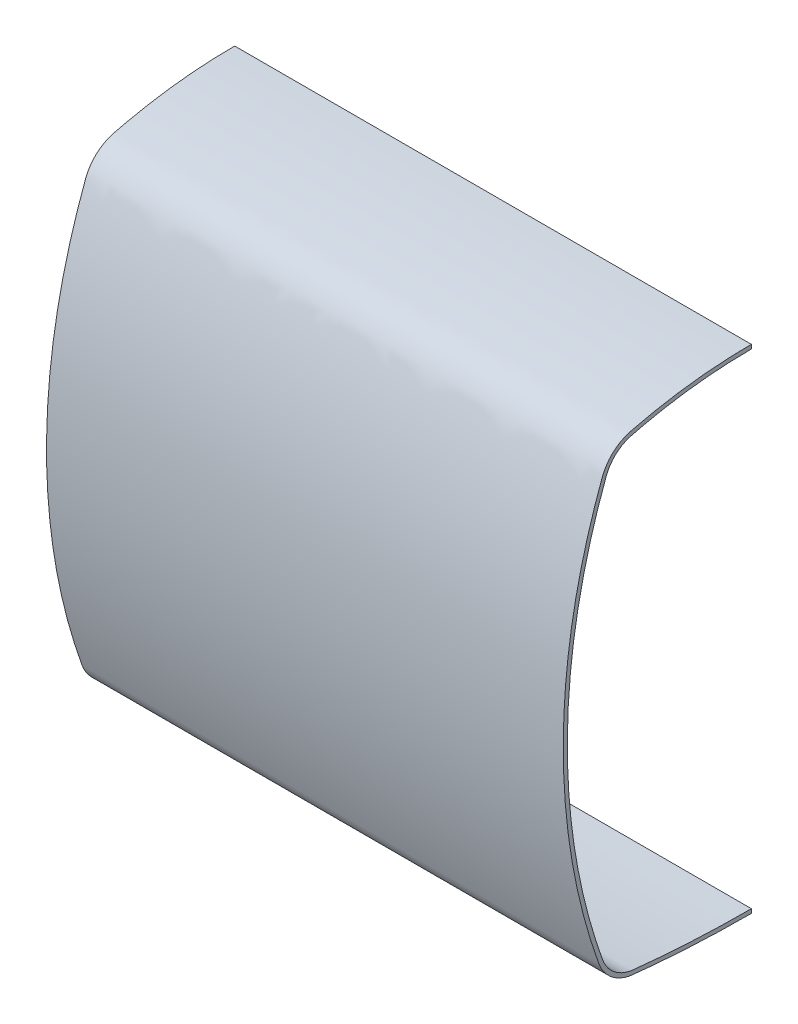
ISO-10303-21;
HEADER;
FILE_DESCRIPTION(('STEP AP214'),'2;1');
FILE_NAME('part.step','',(''),(''),'','','');
FILE_SCHEMA(('AUTOMOTIVE_DESIGN { 1 0 10303 214 1 1 1 1 }'));
ENDSEC;
DATA;
#1=APPLICATION_CONTEXT('core data for automotive mechanical design processes');
#2=APPLICATION_PROTOCOL_DEFINITION('international standard','automotive_design',2000,#1);
#3=PRODUCT_CONTEXT('',#1,'mechanical');
#4=PRODUCT('Part','Part','',(#3));
#5=PRODUCT_RELATED_PRODUCT_CATEGORY('part','',(#4));
#6=PRODUCT_DEFINITION_FORMATION('','',#4);
#7=PRODUCT_DEFINITION_CONTEXT('part definition',#1,'design');
#8=PRODUCT_DEFINITION('design','',#6,#7);
#9=PRODUCT_DEFINITION_SHAPE('','',#8);
#10=(LENGTH_UNIT() NAMED_UNIT(*) SI_UNIT(.MILLI.,.METRE.));
#11=(NAMED_UNIT(*) PLANE_ANGLE_UNIT() SI_UNIT($,.RADIAN.));
#12=(NAMED_UNIT(*) SI_UNIT($,.STERADIAN.) SOLID_ANGLE_UNIT());
#13=UNCERTAINTY_MEASURE_WITH_UNIT(LENGTH_MEASURE(1.E-05),#10,'distance_accuracy_value','');
#14=(GEOMETRIC_REPRESENTATION_CONTEXT(3) GLOBAL_UNCERTAINTY_ASSIGNED_CONTEXT((#13)) GLOBAL_UNIT_ASSIGNED_CONTEXT((#10,
#11,#12)) REPRESENTATION_CONTEXT('',''));
#15=CARTESIAN_POINT('',(0.,0.,0.));
#16=DIRECTION('',(0.,0.,1.));
#17=DIRECTION('',(1.,0.,0.));
#18=AXIS2_PLACEMENT_3D('',#15,#16,#17);
#19=CARTESIAN_POINT('',(8.78246570978219,-0.000208815905838738,-67.4992826169876));
#20=DIRECTION('',(0.,-3.09360185385415E-06,-0.999999999995215));
#21=DIRECTION('',(0.,0.999999999995215,-3.09360185385415E-06));
#22=AXIS2_PLACEMENT_3D('',#19,#20,#21);
#23=PLANE('',#22);
#24=DIRECTION('',(0.,-0.999999999995215,3.09360185385415E-06));
#25=VECTOR('',#24,1.);
#26=CARTESIAN_POINT('',(-245.217534290218,-0.000208815905838738,-67.4992826169912));
#27=LINE('',#26,#25);
#28=CARTESIAN_POINT('',(-245.217534290218,233.892272090022,-67.5000061872037));
#29=VERTEX_POINT('',#28);
#30=CARTESIAN_POINT('',(-245.217534290218,231.892272090032,-67.5000030936018));
#31=VERTEX_POINT('',#30);
#32=EDGE_CURVE('E182',#29,#31,#27,.T.);
#33=ORIENTED_EDGE('',*,*,#32,.F.);
#34=DIRECTION('',(-1.,0.,0.));
#35=VECTOR('',#34,1.);
#36=CARTESIAN_POINT('',(8.78246570978219,233.892272090022,-67.5000061872002));
#37=LINE('',#36,#35);
#38=CARTESIAN_POINT('',(8.78246570978219,233.892272090022,-67.5000061872002));
#39=VERTEX_POINT('',#38);
#40=EDGE_CURVE('E11',#39,#29,#37,.T.);
#41=ORIENTED_EDGE('',*,*,#40,.F.);
#42=DIRECTION('',(0.,-0.999999999995215,3.09360185385415E-06));
#43=VECTOR('',#42,1.);
#44=CARTESIAN_POINT('',(8.78246570978219,-0.000208815905838738,-67.4992826169876));
#45=LINE('',#44,#43);
#46=CARTESIAN_POINT('',(8.78246570978219,231.892272090032,-67.5000030935983));
#47=VERTEX_POINT('',#46);
#48=EDGE_CURVE('E101',#39,#47,#45,.T.);
#49=ORIENTED_EDGE('',*,*,#48,.T.);
#50=DIRECTION('',(-1.,0.,0.));
#51=VECTOR('',#50,1.);
#52=CARTESIAN_POINT('',(8.78246570978219,231.892272090032,-67.5000030935983));
#53=LINE('',#52,#51);
#54=EDGE_CURVE('E80',#47,#31,#53,.T.);
#55=ORIENTED_EDGE('',*,*,#54,.T.);
#56=EDGE_LOOP('',(#33,#41,#49,#55));
#57=FACE_BOUND('',#56,.T.);
#58=ADVANCED_FACE('F35',(#57),#23,.T.);
#59=CARTESIAN_POINT('',(8.78246570978217,233.892272090022,-67.500006187866));
#60=CARTESIAN_POINT('',(8.78246570978195,233.892319476883,-52.1839555399525));
#61=CARTESIAN_POINT('',(8.78246570978167,232.01359161638,-32.2461750610974));
#62=CARTESIAN_POINT('',(8.78246570978139,227.68973171528,-12.6575884362449));
#63=CARTESIAN_POINT('',(8.78246570978133,226.552379867468,-8.12661050035792));
#64=CARTESIAN_POINT('',(8.78246570978133,226.547979285474,-8.10915896757582));
#65=CARTESIAN_POINT('',(8.78246570978133,226.503021067659,-7.93191209356393));
#66=CARTESIAN_POINT('',(8.78246570978131,226.185774729406,-6.74425868833383));
#67=CARTESIAN_POINT('',(8.78246570978131,225.76043493332,-5.59366702691452));
#68=CARTESIAN_POINT('',(8.78246570978125,224.43339153132,-2.71927015616121));
#69=CARTESIAN_POINT('',(8.78246570978122,223.251013954231,-0.950559709095462));
#70=CARTESIAN_POINT('',(8.7824657097812,221.100751363833,1.37001338051112));
#71=CARTESIAN_POINT('',(8.7824657097812,220.320262930464,2.08776292186349));
#72=CARTESIAN_POINT('',(8.78246570978117,218.65561676729,3.39059800286145));
#73=CARTESIAN_POINT('',(8.78246570978117,217.771176315712,3.97667938232067));
#74=CARTESIAN_POINT('',(8.78246570978117,216.381177198879,4.74733583993274));
#75=CARTESIAN_POINT('',(8.78246570978114,215.522241116586,5.18015936811723));
#76=CARTESIAN_POINT('',(8.78246570978114,214.632609129722,5.55049098808137));
#77=CARTESIAN_POINT('',(8.78246570978114,214.197196927592,5.71518280444148));
#78=CARTESIAN_POINT('',(8.78246570978114,214.170856860455,5.72509876730584));
#79=CARTESIAN_POINT('',(8.78246570978111,209.581942578652,7.45541502096086));
#80=CARTESIAN_POINT('',(8.78246570978108,204.989357666766,9.05997207970025));
#81=CARTESIAN_POINT('',(8.78246570978095,171.165167662188,19.9636249000052));
#82=CARTESIAN_POINT('',(8.78246570978089,140.859403623297,24.7753839421631));
#83=CARTESIAN_POINT('',(8.78246570978086,80.1823576588866,25.1770545142248));
#84=CARTESIAN_POINT('',(8.78246570978095,49.8104823448597,20.7669441213031));
#85=CARTESIAN_POINT('',(8.78246570978108,16.2630069524395,10.4386449176215));
#86=CARTESIAN_POINT('',(8.78246570978108,12.0730186135899,9.04685706151721));
#87=CARTESIAN_POINT('',(8.78246570978111,7.87921428871026,7.54969200656834));
#88=CARTESIAN_POINT('',(8.78246570978111,7.84898345729222,7.53890767301116));
#89=CARTESIAN_POINT('',(8.78246570978111,7.44296364108563,7.39258413449234));
#90=CARTESIAN_POINT('',(8.78246570978114,6.08633824878573,6.85729127618674));
#91=CARTESIAN_POINT('',(8.78246570978114,4.80011705299629,6.17931565296963));
#92=CARTESIAN_POINT('',(8.78246570978117,2.12991367822242,4.49106948117171));
#93=CARTESIAN_POINT('',(8.78246570978117,0.531103862547622,3.08678444363357));
#94=CARTESIAN_POINT('',(8.78246570978122,-1.49782907205968,0.631432731081715));
#95=CARTESIAN_POINT('',(8.78246570978122,-2.10682810042635,-0.238574634364076));
#96=CARTESIAN_POINT('',(8.78246570978125,-3.1763003645011,-2.0557690773668));
#97=CARTESIAN_POINT('',(8.78246570978128,-3.63777412103035,-3.00414660100854));
#98=CARTESIAN_POINT('',(8.78246570978128,-4.40665033372113,-4.96218762565491));
#99=CARTESIAN_POINT('',(8.78246570978131,-4.86776066108432,-6.4767030914852));
#100=CARTESIAN_POINT('',(8.78246570978133,-5.18480482901127,-8.25123677079826));
#101=CARTESIAN_POINT('',(8.78246570978136,-5.27478438184112,-8.99217249354377));
#102=CARTESIAN_POINT('',(8.78246570978136,-5.29906682015527,-9.22334960858448));
#103=CARTESIAN_POINT('',(8.78246570978136,-5.30048065008817,-9.23686374047862));
#104=CARTESIAN_POINT('',(8.78246570978142,-5.73033099667643,-13.339274551337));
#105=CARTESIAN_POINT('',(8.78246570978167,-7.54509425054983,-32.7135025968541));
#106=CARTESIAN_POINT('',(8.78246570978195,-8.34543491617509,-52.1399537387909));
#107=CARTESIAN_POINT('',(8.78246570978217,-8.34548826251685,-67.499993053876));
#108=B_SPLINE_CURVE_WITH_KNOTS('',3,(#59,#60,#61,#62,#63,#64,#65,#66,#67,#68,#69,#70,#71,#72,
#73,#74,#75,#76,#77,#78,#79,#80,#81,#82,#83,#84,#85,#86,#87,#88,#89,#90,#91,#92,#93,#94,#95,#96,
#97,#98,#99,#100,#101,#102,#103,#104,#105,#106,#107),.UNSPECIFIED.,.F.,.F.,(4,1,2,2,1,2,2,2,2,1,
2,2,2,2,2,2,2,1,2,2,2,2,1,1,2,2,1,4),(0.,0.125,0.1627197265625,0.162841796875,0.1640625,
0.171875,0.1875,0.1953125,0.203125,0.20703125,0.210205078125,0.21044921875,0.25,0.5,0.75,
0.785888671875,0.7861328125,0.7890625,0.796875,0.8125,0.8203125,0.828125,0.8359375,0.83984375,
0.8414306640625,0.841552734375,0.875,1.),.UNSPECIFIED.);
#109=DIRECTION('',(-1.,0.,0.));
#110=VECTOR('',#109,1.);
#111=SURFACE_OF_LINEAR_EXTRUSION('',#108,#110);
#112=CARTESIAN_POINT('',(-245.217534290218,233.892272090022,-67.5000061878695));
#113=CARTESIAN_POINT('',(-245.217534290218,233.892319476883,-52.183955539956));
#114=CARTESIAN_POINT('',(-245.217534290218,232.01359161638,-32.2461750611009));
#115=CARTESIAN_POINT('',(-245.217534290219,227.68973171528,-12.6575884362484));
#116=CARTESIAN_POINT('',(-245.217534290219,226.552379867468,-8.12661050036147));
#117=CARTESIAN_POINT('',(-245.217534290219,226.547979285474,-8.10915896757936));
#118=CARTESIAN_POINT('',(-245.217534290219,226.503021067659,-7.93191209356748));
#119=CARTESIAN_POINT('',(-245.217534290219,226.185774729406,-6.74425868833737));
#120=CARTESIAN_POINT('',(-245.217534290219,225.76043493332,-5.59366702691807));
#121=CARTESIAN_POINT('',(-245.217534290219,224.43339153132,-2.71927015616475));
#122=CARTESIAN_POINT('',(-245.217534290219,223.251013954231,-0.950559709099009));
#123=CARTESIAN_POINT('',(-245.217534290219,221.100751363833,1.37001338050758));
#124=CARTESIAN_POINT('',(-245.217534290219,220.320262930464,2.08776292185995));
#125=CARTESIAN_POINT('',(-245.217534290219,218.65561676729,3.39059800285791));
#126=CARTESIAN_POINT('',(-245.217534290219,217.771176315712,3.97667938231712));
#127=CARTESIAN_POINT('',(-245.217534290219,216.381177198879,4.74733583992919));
#128=CARTESIAN_POINT('',(-245.217534290219,215.522241116586,5.18015936811369));
#129=CARTESIAN_POINT('',(-245.217534290219,214.632609129722,5.55049098807782));
#130=CARTESIAN_POINT('',(-245.217534290219,214.197196927592,5.71518280443794));
#131=CARTESIAN_POINT('',(-245.217534290219,214.170856860455,5.72509876730229));
#132=CARTESIAN_POINT('',(-245.217534290219,209.581942578652,7.45541502095731));
#133=CARTESIAN_POINT('',(-245.217534290219,204.989357666766,9.0599720796967));
#134=CARTESIAN_POINT('',(-245.217534290219,171.165167662188,19.9636249000017));
#135=CARTESIAN_POINT('',(-245.217534290219,140.859403623297,24.7753839421596));
#136=CARTESIAN_POINT('',(-245.217534290219,80.1823576588866,25.1770545142212));
#137=CARTESIAN_POINT('',(-245.217534290219,49.8104823448597,20.7669441212995));
#138=CARTESIAN_POINT('',(-245.217534290219,16.2630069524395,10.438644917618));
#139=CARTESIAN_POINT('',(-245.217534290219,12.0730186135899,9.04685706151366));
#140=CARTESIAN_POINT('',(-245.217534290219,7.87921428871026,7.54969200656479));
#141=CARTESIAN_POINT('',(-245.217534290219,7.84898345729222,7.53890767300761));
#142=CARTESIAN_POINT('',(-245.217534290219,7.44296364108563,7.3925841344888));
#143=CARTESIAN_POINT('',(-245.217534290219,6.08633824878573,6.85729127618319));
#144=CARTESIAN_POINT('',(-245.217534290219,4.80011705299629,6.17931565296608));
#145=CARTESIAN_POINT('',(-245.217534290219,2.12991367822242,4.49106948116816));
#146=CARTESIAN_POINT('',(-245.217534290219,0.531103862547622,3.08678444363002));
#147=CARTESIAN_POINT('',(-245.217534290219,-1.49782907205968,0.631432731078168));
#148=CARTESIAN_POINT('',(-245.217534290219,-2.10682810042635,-0.238574634367623));
#149=CARTESIAN_POINT('',(-245.217534290219,-3.1763003645011,-2.05576907737035));
#150=CARTESIAN_POINT('',(-245.217534290219,-3.63777412103035,-3.00414660101208));
#151=CARTESIAN_POINT('',(-245.217534290219,-4.40665033372113,-4.96218762565846));
#152=CARTESIAN_POINT('',(-245.217534290219,-4.86776066108432,-6.47670309148875));
#153=CARTESIAN_POINT('',(-245.217534290219,-5.18480482901127,-8.25123677080181));
#154=CARTESIAN_POINT('',(-245.217534290219,-5.27478438184112,-8.99217249354732));
#155=CARTESIAN_POINT('',(-245.217534290219,-5.29906682015527,-9.22334960858803));
#156=CARTESIAN_POINT('',(-245.217534290219,-5.30048065008817,-9.23686374048217));
#157=CARTESIAN_POINT('',(-245.217534290219,-5.73033099667643,-13.3392745513405));
#158=CARTESIAN_POINT('',(-245.217534290218,-7.54509425054983,-32.7135025968577));
#159=CARTESIAN_POINT('',(-245.217534290218,-8.34543491617509,-52.1399537387944));
#160=CARTESIAN_POINT('',(-245.217534290218,-8.34548826251685,-67.4999930538795));
#161=B_SPLINE_CURVE_WITH_KNOTS('',3,(#112,#113,#114,#115,#116,#117,#118,#119,#120,#121,#122,
#123,#124,#125,#126,#127,#128,#129,#130,#131,#132,#133,#134,#135,#136,#137,#138,#139,#140,#141,
#142,#143,#144,#145,#146,#147,#148,#149,#150,#151,#152,#153,#154,#155,#156,#157,#158,#159,#160),
.UNSPECIFIED.,.F.,.F.,(4,1,2,2,1,2,2,2,2,1,2,2,2,2,2,2,2,1,2,2,2,2,1,1,2,2,1,4),(0.,0.125,
0.1627197265625,0.162841796875,0.1640625,0.171875,0.1875,0.1953125,0.203125,0.20703125,
0.210205078125,0.21044921875,0.25,0.5,0.75,0.785888671875,0.7861328125,0.7890625,0.796875,
0.8125,0.8203125,0.828125,0.8359375,0.83984375,0.8414306640625,0.841552734375,0.875,1.),.UNSPECIFIED.);
#162=CARTESIAN_POINT('',(-245.217534290218,-8.34548826251621,-67.5));
#163=VERTEX_POINT('',#162);
#164=EDGE_CURVE('E166',#29,#163,#161,.T.);
#165=ORIENTED_EDGE('',*,*,#164,.T.);
#166=CARTESIAN_POINT('',(-245.217534290218,-8.34548826251685,-67.4999930538795));
#167=DIRECTION('',(1.,0.,0.));
#168=VECTOR('',#167,1.);
#169=LINE('',#166,#168);
#170=CARTESIAN_POINT('',(8.78246570978219,-8.34548826251621,-67.4999999999965));
#171=VERTEX_POINT('',#170);
#172=EDGE_CURVE('E45',#171,#163,#169,.F.);
#173=ORIENTED_EDGE('',*,*,#172,.F.);
#174=CARTESIAN_POINT('',(8.78246570978217,-8.34548826251685,-67.499993053876));
#175=CARTESIAN_POINT('',(8.78246570978195,-8.34543491617509,-52.1399537387909));
#176=CARTESIAN_POINT('',(8.78246570978167,-7.54509425054983,-32.7135025968541));
#177=CARTESIAN_POINT('',(8.78246570978142,-5.73033099667643,-13.339274551337));
#178=CARTESIAN_POINT('',(8.78246570978136,-5.30048065008817,-9.23686374047862));
#179=CARTESIAN_POINT('',(8.78246570978136,-5.29906682015527,-9.22334960858448));
#180=CARTESIAN_POINT('',(8.78246570978136,-5.27478438184112,-8.99217249354377));
#181=CARTESIAN_POINT('',(8.78246570978133,-5.18480482901127,-8.25123677079826));
#182=CARTESIAN_POINT('',(8.78246570978131,-4.86776066108432,-6.4767030914852));
#183=CARTESIAN_POINT('',(8.78246570978128,-4.40665033372113,-4.96218762565491));
#184=CARTESIAN_POINT('',(8.78246570978128,-3.63777412103035,-3.00414660100854));
#185=CARTESIAN_POINT('',(8.78246570978125,-3.1763003645011,-2.0557690773668));
#186=CARTESIAN_POINT('',(8.78246570978122,-2.10682810042635,-0.238574634364076));
#187=CARTESIAN_POINT('',(8.78246570978122,-1.49782907205968,0.631432731081715));
#188=CARTESIAN_POINT('',(8.78246570978117,0.531103862547622,3.08678444363357));
#189=CARTESIAN_POINT('',(8.78246570978117,2.12991367822242,4.49106948117171));
#190=CARTESIAN_POINT('',(8.78246570978114,4.80011705299629,6.17931565296963));
#191=CARTESIAN_POINT('',(8.78246570978114,6.08633824878573,6.85729127618674));
#192=CARTESIAN_POINT('',(8.78246570978111,7.44296364108563,7.39258413449234));
#193=CARTESIAN_POINT('',(8.78246570978111,7.84898345729222,7.53890767301116));
#194=CARTESIAN_POINT('',(8.78246570978111,7.87921428871026,7.54969200656834));
#195=CARTESIAN_POINT('',(8.78246570978108,12.0730186135899,9.04685706151721));
#196=CARTESIAN_POINT('',(8.78246570978108,16.2630069524395,10.4386449176215));
#197=CARTESIAN_POINT('',(8.78246570978095,49.8104823448597,20.7669441213031));
#198=CARTESIAN_POINT('',(8.78246570978086,80.1823576588866,25.1770545142248));
#199=CARTESIAN_POINT('',(8.78246570978089,140.859403623297,24.7753839421631));
#200=CARTESIAN_POINT('',(8.78246570978095,171.165167662188,19.9636249000052));
#201=CARTESIAN_POINT('',(8.78246570978108,204.989357666766,9.05997207970025));
#202=CARTESIAN_POINT('',(8.78246570978111,209.581942578652,7.45541502096086));
#203=CARTESIAN_POINT('',(8.78246570978114,214.170856860455,5.72509876730584));
#204=CARTESIAN_POINT('',(8.78246570978114,214.197196927592,5.71518280444148));
#205=CARTESIAN_POINT('',(8.78246570978114,214.632609129722,5.55049098808137));
#206=CARTESIAN_POINT('',(8.78246570978114,215.522241116586,5.18015936811723));
#207=CARTESIAN_POINT('',(8.78246570978117,216.381177198879,4.74733583993274));
#208=CARTESIAN_POINT('',(8.78246570978117,217.771176315712,3.97667938232067));
#209=CARTESIAN_POINT('',(8.78246570978117,218.65561676729,3.39059800286145));
#210=CARTESIAN_POINT('',(8.7824657097812,220.320262930464,2.08776292186349));
#211=CARTESIAN_POINT('',(8.7824657097812,221.100751363833,1.37001338051112));
#212=CARTESIAN_POINT('',(8.78246570978122,223.251013954231,-0.950559709095462));
#213=CARTESIAN_POINT('',(8.78246570978125,224.43339153132,-2.71927015616121));
#214=CARTESIAN_POINT('',(8.78246570978131,225.76043493332,-5.59366702691452));
#215=CARTESIAN_POINT('',(8.78246570978131,226.185774729406,-6.74425868833383));
#216=CARTESIAN_POINT('',(8.78246570978133,226.503021067659,-7.93191209356393));
#217=CARTESIAN_POINT('',(8.78246570978133,226.547979285474,-8.10915896757582));
#218=CARTESIAN_POINT('',(8.78246570978133,226.552379867468,-8.12661050035792));
#219=CARTESIAN_POINT('',(8.78246570978139,227.68973171528,-12.6575884362449));
#220=CARTESIAN_POINT('',(8.78246570978167,232.01359161638,-32.2461750610974));
#221=CARTESIAN_POINT('',(8.78246570978195,233.892319476883,-52.1839555399525));
#222=CARTESIAN_POINT('',(8.78246570978217,233.892272090022,-67.500006187866));
#223=B_SPLINE_CURVE_WITH_KNOTS('',3,(#174,#175,#176,#177,#178,#179,#180,#181,#182,#183,#184,
#185,#186,#187,#188,#189,#190,#191,#192,#193,#194,#195,#196,#197,#198,#199,#200,#201,#202,#203,
#204,#205,#206,#207,#208,#209,#210,#211,#212,#213,#214,#215,#216,#217,#218,#219,#220,#221,#222),
.UNSPECIFIED.,.F.,.F.,(4,1,2,2,1,1,2,2,2,2,1,2,2,2,2,2,2,2,1,2,2,2,2,1,2,2,1,4),(0.,0.125,
0.158447265625,0.1585693359375,0.16015625,0.1640625,0.171875,0.1796875,0.1875,0.203125,
0.2109375,0.2138671875,0.214111328125,0.25,0.5,0.75,0.78955078125,0.789794921875,0.79296875,
0.796875,0.8046875,0.8125,0.828125,0.8359375,0.837158203125,0.8372802734375,0.875,1.),.UNSPECIFIED.);
#224=EDGE_CURVE('E96',#39,#171,#223,.F.);
#225=ORIENTED_EDGE('',*,*,#224,.F.);
#226=ORIENTED_EDGE('',*,*,#40,.T.);
#227=EDGE_LOOP('',(#165,#173,#225,#226));
#228=FACE_BOUND('',#227,.T.);
#229=ADVANCED_FACE('F138',(#228),#111,.F.);
#230=CARTESIAN_POINT('',(8.78246570978219,-0.0002406524621146,-67.5000226222031));
#231=DIRECTION('',(0.,-3.56522046607302E-06,-0.999999999993645));
#232=DIRECTION('',(0.,0.999999999993645,-3.56522046607302E-06));
#233=AXIS2_PLACEMENT_3D('',#230,#231,#232);
#234=PLANE('',#233);
#235=DIRECTION('',(0.,-0.999999999993645,3.56522046607302E-06));
#236=VECTOR('',#235,1.);
#237=CARTESIAN_POINT('',(-245.217534290218,-0.0002406524621146,-67.5000226222067));
#238=LINE('',#237,#236);
#239=CARTESIAN_POINT('',(-245.217534290218,-6.34548826252891,-67.5));
#240=VERTEX_POINT('',#239);
#241=EDGE_CURVE('E88',#240,#163,#238,.T.);
#242=ORIENTED_EDGE('',*,*,#241,.F.);
#243=DIRECTION('',(-1.,0.,0.));
#244=VECTOR('',#243,1.);
#245=CARTESIAN_POINT('',(8.78246570978219,-6.34548826252891,-67.4999999999965));
#246=LINE('',#245,#244);
#247=CARTESIAN_POINT('',(8.78246570978219,-6.34548826252891,-67.4999999999965));
#248=VERTEX_POINT('',#247);
#249=EDGE_CURVE('E83',#248,#240,#246,.T.);
#250=ORIENTED_EDGE('',*,*,#249,.F.);
#251=DIRECTION('',(0.,-0.999999999993645,3.56522046607302E-06));
#252=VECTOR('',#251,1.);
#253=CARTESIAN_POINT('',(8.78246570978219,-0.0002406524621146,-67.5000226222031));
#254=LINE('',#253,#252);
#255=EDGE_CURVE('E86',#248,#171,#254,.T.);
#256=ORIENTED_EDGE('',*,*,#255,.T.);
#257=ORIENTED_EDGE('',*,*,#172,.T.);
#258=EDGE_LOOP('',(#242,#250,#256,#257));
#259=FACE_BOUND('',#258,.T.);
#260=ADVANCED_FACE('F85',(#259),#234,.T.);
#261=CARTESIAN_POINT('',(8.78246570978217,231.892272090031,-67.4999999999964));
#262=CARTESIAN_POINT('',(8.78246570978189,231.892333272231,-47.7251164198151));
#263=CARTESIAN_POINT('',(8.78246570978161,229.467608244975,-27.9502328396336));
#264=CARTESIAN_POINT('',(8.78246570978131,223.790399934121,-5.32752160182484));
#265=CARTESIAN_POINT('',(8.78246570978122,220.775187999517,-0.172030562504195));
#266=CARTESIAN_POINT('',(8.78246570978117,215.77166271282,2.98506740416708));
#267=CARTESIAN_POINT('',(8.78246570978084,147.56395483128,28.7207147960687));
#268=CARTESIAN_POINT('',(8.78246570978081,74.9209182688053,29.3677972846207));
#269=CARTESIAN_POINT('',(8.78246570978117,5.42041639594355,4.54978280371657));
#270=CARTESIAN_POINT('',(8.7824657097812,2.66735523848169,2.59532701656753));
#271=CARTESIAN_POINT('',(8.78246570978125,-1.59552782230195,-2.68617151090382));
#272=CARTESIAN_POINT('',(8.78246570978131,-2.94893024594005,-5.96252396423689));
#273=CARTESIAN_POINT('',(8.78246570978161,-5.33398165525185,-28.7257617987844));
#274=CARTESIAN_POINT('',(8.78246570978189,-6.34542083308974,-48.0850072869532));
#275=CARTESIAN_POINT('',(8.78246570978217,-6.34548826252891,-67.4999999999964));
#276=B_SPLINE_CURVE_WITH_KNOTS('',3,(#261,#262,#263,#264,#265,#266,#267,#268,#269,#270,#271,
#272,#273,#274,#275),.UNSPECIFIED.,.F.,.F.,(4,2,1,2,2,2,2,4),(0.,0.162724531254987,
0.190497492240693,0.210236448222468,0.785999019302845,0.813067494852642,0.841435540742329,1.),.UNSPECIFIED.);
#277=DIRECTION('',(-1.,0.,0.));
#278=VECTOR('',#277,1.);
#279=SURFACE_OF_LINEAR_EXTRUSION('',#276,#278);
#280=CARTESIAN_POINT('',(-245.217534290218,-6.34548826252891,-67.5));
#281=CARTESIAN_POINT('',(-245.217534290218,-6.34542083308974,-48.0850072869567));
#282=CARTESIAN_POINT('',(-245.217534290218,-5.33398165525185,-28.7257617987879));
#283=CARTESIAN_POINT('',(-245.217534290219,-2.94893024594005,-5.96252396424044));
#284=CARTESIAN_POINT('',(-245.217534290219,-1.59552782230195,-2.68617151090737));
#285=CARTESIAN_POINT('',(-245.217534290219,2.66735523848169,2.59532701656398));
#286=CARTESIAN_POINT('',(-245.217534290219,5.42041639594355,4.54978280371302));
#287=CARTESIAN_POINT('',(-245.217534290219,74.9209182688053,29.3677972846172));
#288=CARTESIAN_POINT('',(-245.217534290219,147.56395483128,28.7207147960652));
#289=CARTESIAN_POINT('',(-245.217534290219,215.77166271282,2.98506740416353));
#290=CARTESIAN_POINT('',(-245.217534290219,220.775187999517,-0.172030562507742));
#291=CARTESIAN_POINT('',(-245.217534290219,223.790399934121,-5.32752160182839));
#292=CARTESIAN_POINT('',(-245.217534290218,229.467608244975,-27.9502328396372));
#293=CARTESIAN_POINT('',(-245.217534290218,231.892333272231,-47.7251164198187));
#294=CARTESIAN_POINT('',(-245.217534290218,231.892272090031,-67.5));
#295=B_SPLINE_CURVE_WITH_KNOTS('',3,(#280,#281,#282,#283,#284,#285,#286,#287,#288,#289,#290,
#291,#292,#293,#294),.UNSPECIFIED.,.F.,.F.,(4,2,2,2,2,1,2,4),(0.,0.158564459257671,
0.186932505147358,0.214000980697155,0.789763551777532,0.809502507759307,0.837275468745013,1.),.UNSPECIFIED.);
#296=EDGE_CURVE('E188',#31,#240,#295,.F.);
#297=ORIENTED_EDGE('',*,*,#296,.F.);
#298=ORIENTED_EDGE('',*,*,#54,.F.);
#299=CARTESIAN_POINT('',(8.78246570978217,231.892272090031,-67.4999999999964));
#300=CARTESIAN_POINT('',(8.78246570978189,231.892333272231,-47.7251164198151));
#301=CARTESIAN_POINT('',(8.78246570978161,229.467608244975,-27.9502328396336));
#302=CARTESIAN_POINT('',(8.78246570978131,223.790399934121,-5.32752160182484));
#303=CARTESIAN_POINT('',(8.78246570978122,220.775187999517,-0.172030562504195));
#304=CARTESIAN_POINT('',(8.78246570978117,215.77166271282,2.98506740416708));
#305=CARTESIAN_POINT('',(8.78246570978084,147.56395483128,28.7207147960687));
#306=CARTESIAN_POINT('',(8.78246570978081,74.9209182688053,29.3677972846207));
#307=CARTESIAN_POINT('',(8.78246570978117,5.42041639594355,4.54978280371657));
#308=CARTESIAN_POINT('',(8.7824657097812,2.66735523848169,2.59532701656753));
#309=CARTESIAN_POINT('',(8.78246570978125,-1.59552782230195,-2.68617151090382));
#310=CARTESIAN_POINT('',(8.78246570978131,-2.94893024594005,-5.96252396423689));
#311=CARTESIAN_POINT('',(8.78246570978161,-5.33398165525185,-28.7257617987844));
#312=CARTESIAN_POINT('',(8.78246570978189,-6.34542083308974,-48.0850072869532));
#313=CARTESIAN_POINT('',(8.78246570978217,-6.34548826252891,-67.4999999999964));
#314=B_SPLINE_CURVE_WITH_KNOTS('',3,(#299,#300,#301,#302,#303,#304,#305,#306,#307,#308,#309,
#310,#311,#312,#313),.UNSPECIFIED.,.F.,.F.,(4,2,1,2,2,2,2,4),(0.,0.162724531254987,
0.190497492240693,0.210236448222468,0.785999019302845,0.813067494852642,0.841435540742329,1.),.UNSPECIFIED.);
#315=EDGE_CURVE('E94',#47,#248,#314,.T.);
#316=ORIENTED_EDGE('',*,*,#315,.T.);
#317=ORIENTED_EDGE('',*,*,#249,.T.);
#318=EDGE_LOOP('',(#297,#298,#316,#317));
#319=FACE_BOUND('',#318,.T.);
#320=ADVANCED_FACE('F100',(#319),#279,.T.);
#321=CARTESIAN_POINT('',(8.78246570978125,0.,1.35507053140131E-13));
#322=DIRECTION('',(-1.,0.,0.));
#323=DIRECTION('',(0.,0.,1.));
#324=AXIS2_PLACEMENT_3D('',#321,#322,#323);
#325=PLANE('',#324);
#326=ORIENTED_EDGE('',*,*,#48,.F.);
#327=ORIENTED_EDGE('',*,*,#224,.T.);
#328=ORIENTED_EDGE('',*,*,#255,.F.);
#329=ORIENTED_EDGE('',*,*,#315,.F.);
#330=EDGE_LOOP('',(#326,#327,#328,#329));
#331=FACE_BOUND('',#330,.T.);
#332=ADVANCED_FACE('F93',(#331),#325,.F.);
#333=CARTESIAN_POINT('',(-245.217534290219,0.,-3.41183798712449E-12));
#334=DIRECTION('',(-1.,0.,0.));
#335=DIRECTION('',(0.,0.,1.));
#336=AXIS2_PLACEMENT_3D('',#333,#334,#335);
#337=PLANE('',#336);
#338=ORIENTED_EDGE('',*,*,#32,.T.);
#339=ORIENTED_EDGE('',*,*,#296,.T.);
#340=ORIENTED_EDGE('',*,*,#241,.T.);
#341=ORIENTED_EDGE('',*,*,#164,.F.);
#342=EDGE_LOOP('',(#338,#339,#340,#341));
#343=FACE_BOUND('',#342,.T.);
#344=ADVANCED_FACE('F142',(#343),#337,.T.);
#345=CLOSED_SHELL('',(#58,#229,#260,#320,#332,#344));
#346=MANIFOLD_SOLID_BREP('B2',#345);
#347=ADVANCED_BREP_SHAPE_REPRESENTATION('',(#18,#346),#14);
#348=SHAPE_DEFINITION_REPRESENTATION(#9,#347);
ENDSEC;
END-ISO-10303-21;
